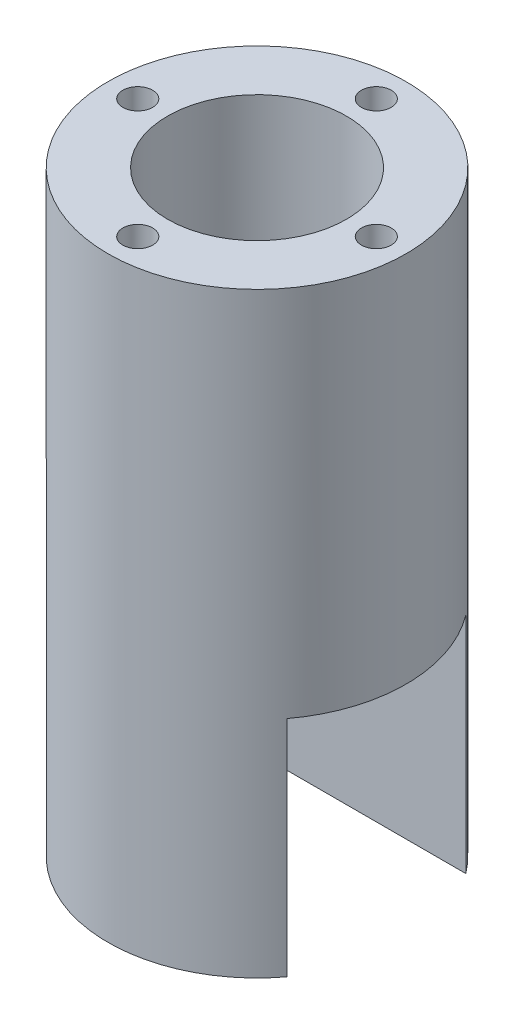
ISO-10303-21;
HEADER;
FILE_DESCRIPTION(('STEP AP214'),'2;1');
FILE_NAME('part.step','',(''),(''),'','','');
FILE_SCHEMA(('AUTOMOTIVE_DESIGN { 1 0 10303 214 1 1 1 1 }'));
ENDSEC;
DATA;
#1=APPLICATION_CONTEXT('core data for automotive mechanical design processes');
#2=APPLICATION_PROTOCOL_DEFINITION('international standard','automotive_design',2000,#1);
#3=PRODUCT_CONTEXT('',#1,'mechanical');
#4=PRODUCT('Part','Part','',(#3));
#5=PRODUCT_RELATED_PRODUCT_CATEGORY('part','',(#4));
#6=PRODUCT_DEFINITION_FORMATION('','',#4);
#7=PRODUCT_DEFINITION_CONTEXT('part definition',#1,'design');
#8=PRODUCT_DEFINITION('design','',#6,#7);
#9=PRODUCT_DEFINITION_SHAPE('','',#8);
#10=(LENGTH_UNIT() NAMED_UNIT(*) SI_UNIT(.MILLI.,.METRE.));
#11=(NAMED_UNIT(*) PLANE_ANGLE_UNIT() SI_UNIT($,.RADIAN.));
#12=(NAMED_UNIT(*) SI_UNIT($,.STERADIAN.) SOLID_ANGLE_UNIT());
#13=UNCERTAINTY_MEASURE_WITH_UNIT(LENGTH_MEASURE(1.E-05),#10,'distance_accuracy_value','');
#14=(GEOMETRIC_REPRESENTATION_CONTEXT(3) GLOBAL_UNCERTAINTY_ASSIGNED_CONTEXT((#13)) GLOBAL_UNIT_ASSIGNED_CONTEXT((#10,
#11,#12)) REPRESENTATION_CONTEXT('',''));
#15=CARTESIAN_POINT('',(0.,0.,0.));
#16=DIRECTION('',(0.,0.,1.));
#17=DIRECTION('',(1.,0.,0.));
#18=AXIS2_PLACEMENT_3D('',#15,#16,#17);
#19=CARTESIAN_POINT('',(0.,0.,0.));
#20=DIRECTION('',(0.,1.,0.));
#21=DIRECTION('',(0.,0.,1.));
#22=AXIS2_PLACEMENT_3D('',#19,#20,#21);
#23=PLANE('',#22);
#24=CARTESIAN_POINT('',(0.,0.,0.));
#25=DIRECTION('',(0.,1.,0.));
#26=DIRECTION('',(0.,0.,1.));
#27=AXIS2_PLACEMENT_3D('',#24,#25,#26);
#28=CIRCLE('',#27,10.);
#29=CARTESIAN_POINT('',(-8.,0.,6.));
#30=VERTEX_POINT('',#29);
#31=CARTESIAN_POINT('',(8.,0.,6.));
#32=VERTEX_POINT('',#31);
#33=EDGE_CURVE('E98',#30,#32,#28,.T.);
#34=ORIENTED_EDGE('',*,*,#33,.F.);
#35=DIRECTION('',(1.,0.,0.));
#36=VECTOR('',#35,1.);
#37=CARTESIAN_POINT('',(-10.,0.,6.));
#38=LINE('',#37,#36);
#39=EDGE_CURVE('E87',#30,#32,#38,.T.);
#40=ORIENTED_EDGE('',*,*,#39,.T.);
#41=EDGE_LOOP('',(#34,#40));
#42=FACE_BOUND('',#41,.T.);
#43=ADVANCED_FACE('F36',(#42),#23,.F.);
#44=CARTESIAN_POINT('',(0.,40.,0.));
#45=DIRECTION('',(0.,1.,0.));
#46=DIRECTION('',(0.,0.,1.));
#47=AXIS2_PLACEMENT_3D('',#44,#45,#46);
#48=PLANE('',#47);
#49=CARTESIAN_POINT('',(0.,40.,8.));
#50=DIRECTION('',(0.,1.,0.));
#51=DIRECTION('',(0.,0.,-1.));
#52=AXIS2_PLACEMENT_3D('',#49,#50,#51);
#53=CIRCLE('',#52,1.);
#54=CARTESIAN_POINT('',(0.,40.,7.));
#55=VERTEX_POINT('',#54);
#56=EDGE_CURVE('E124',#55,#55,#53,.T.);
#57=ORIENTED_EDGE('',*,*,#56,.F.);
#58=EDGE_LOOP('',(#57));
#59=FACE_BOUND('',#58,.T.);
#60=CARTESIAN_POINT('',(0.,40.,-8.));
#61=DIRECTION('',(0.,1.,0.));
#62=DIRECTION('',(0.,0.,1.));
#63=AXIS2_PLACEMENT_3D('',#60,#61,#62);
#64=CIRCLE('',#63,1.);
#65=CARTESIAN_POINT('',(0.,40.,-7.));
#66=VERTEX_POINT('',#65);
#67=EDGE_CURVE('E118',#66,#66,#64,.T.);
#68=ORIENTED_EDGE('',*,*,#67,.F.);
#69=EDGE_LOOP('',(#68));
#70=FACE_BOUND('',#69,.T.);
#71=CARTESIAN_POINT('',(8.,40.,0.));
#72=DIRECTION('',(0.,1.,0.));
#73=DIRECTION('',(0.,0.,-1.));
#74=AXIS2_PLACEMENT_3D('',#71,#72,#73);
#75=CIRCLE('',#74,1.);
#76=CARTESIAN_POINT('',(8.,40.,-1.));
#77=VERTEX_POINT('',#76);
#78=EDGE_CURVE('E112',#77,#77,#75,.T.);
#79=ORIENTED_EDGE('',*,*,#78,.F.);
#80=EDGE_LOOP('',(#79));
#81=FACE_BOUND('',#80,.T.);
#82=CARTESIAN_POINT('',(-8.,40.,0.));
#83=DIRECTION('',(0.,1.,0.));
#84=DIRECTION('',(0.,0.,1.));
#85=AXIS2_PLACEMENT_3D('',#82,#83,#84);
#86=CIRCLE('',#85,1.);
#87=CARTESIAN_POINT('',(-8.,40.,1.));
#88=VERTEX_POINT('',#87);
#89=EDGE_CURVE('E106',#88,#88,#86,.T.);
#90=ORIENTED_EDGE('',*,*,#89,.F.);
#91=EDGE_LOOP('',(#90));
#92=FACE_BOUND('',#91,.T.);
#93=CARTESIAN_POINT('',(0.,40.,0.));
#94=DIRECTION('',(0.,1.,0.));
#95=DIRECTION('',(0.,0.,1.));
#96=AXIS2_PLACEMENT_3D('',#93,#94,#95);
#97=CIRCLE('',#96,10.);
#98=CARTESIAN_POINT('',(0.,40.,10.));
#99=VERTEX_POINT('',#98);
#100=EDGE_CURVE('E97',#99,#99,#97,.T.);
#101=ORIENTED_EDGE('',*,*,#100,.T.);
#102=EDGE_LOOP('',(#101));
#103=FACE_BOUND('',#102,.T.);
#104=CARTESIAN_POINT('',(0.,40.,0.));
#105=DIRECTION('',(0.,1.,0.));
#106=DIRECTION('',(0.,0.,1.));
#107=AXIS2_PLACEMENT_3D('',#104,#105,#106);
#108=CIRCLE('',#107,6.);
#109=CARTESIAN_POINT('',(0.,40.,6.));
#110=VERTEX_POINT('',#109);
#111=EDGE_CURVE('E101',#110,#110,#108,.T.);
#112=ORIENTED_EDGE('',*,*,#111,.F.);
#113=EDGE_LOOP('',(#112));
#114=FACE_BOUND('',#113,.T.);
#115=ADVANCED_FACE('F161',(#59,#70,#81,#92,#103,#114),#48,.T.);
#116=CARTESIAN_POINT('',(8.,0.,-6.));
#117=VERTEX_POINT('',#116);
#118=CARTESIAN_POINT('',(-8.,0.,-6.));
#119=VERTEX_POINT('',#118);
#120=EDGE_CURVE('E83',#117,#119,#28,.T.);
#121=ORIENTED_EDGE('',*,*,#120,.F.);
#122=DIRECTION('',(1.,0.,0.));
#123=VECTOR('',#122,1.);
#124=CARTESIAN_POINT('',(-10.,0.,-6.));
#125=LINE('',#124,#123);
#126=EDGE_CURVE('E80',#119,#117,#125,.T.);
#127=ORIENTED_EDGE('',*,*,#126,.F.);
#128=EDGE_LOOP('',(#121,#127));
#129=FACE_BOUND('',#128,.T.);
#130=ADVANCED_FACE('F81',(#129),#23,.F.);
#131=CARTESIAN_POINT('',(0.,40.,0.));
#132=DIRECTION('',(0.,-1.,0.));
#133=DIRECTION('',(0.,0.,-1.));
#134=AXIS2_PLACEMENT_3D('',#131,#132,#133);
#135=CYLINDRICAL_SURFACE('',#134,10.);
#136=ORIENTED_EDGE('',*,*,#100,.F.);
#137=EDGE_LOOP('',(#136));
#138=FACE_BOUND('',#137,.T.);
#139=ORIENTED_EDGE('',*,*,#33,.T.);
#140=DIRECTION('',(0.,-1.,0.));
#141=VECTOR('',#140,1.);
#142=CARTESIAN_POINT('',(8.,40.,6.));
#143=LINE('',#142,#141);
#144=CARTESIAN_POINT('',(8.,15.,6.));
#145=VERTEX_POINT('',#144);
#146=EDGE_CURVE('E132',#32,#145,#143,.F.);
#147=ORIENTED_EDGE('',*,*,#146,.T.);
#148=CARTESIAN_POINT('',(0.,15.,0.));
#149=DIRECTION('',(0.,1.,0.));
#150=DIRECTION('',(0.,0.,1.));
#151=AXIS2_PLACEMENT_3D('',#148,#149,#150);
#152=CIRCLE('',#151,10.);
#153=CARTESIAN_POINT('',(8.00000000000001,15.,-6.));
#154=VERTEX_POINT('',#153);
#155=EDGE_CURVE('E135',#145,#154,#152,.T.);
#156=ORIENTED_EDGE('',*,*,#155,.T.);
#157=DIRECTION('',(0.,-1.,0.));
#158=VECTOR('',#157,1.);
#159=CARTESIAN_POINT('',(8.00000000000001,40.,-5.99999999999999));
#160=LINE('',#159,#158);
#161=EDGE_CURVE('E93',#154,#117,#160,.T.);
#162=ORIENTED_EDGE('',*,*,#161,.T.);
#163=ORIENTED_EDGE('',*,*,#120,.T.);
#164=DIRECTION('',(0.,-1.,0.));
#165=VECTOR('',#164,1.);
#166=CARTESIAN_POINT('',(-8.00000000000001,40.,-5.99999999999999));
#167=LINE('',#166,#165);
#168=CARTESIAN_POINT('',(-8.00000000000001,15.,-5.99999999999999));
#169=VERTEX_POINT('',#168);
#170=EDGE_CURVE('E90',#119,#169,#167,.F.);
#171=ORIENTED_EDGE('',*,*,#170,.T.);
#172=CARTESIAN_POINT('',(-8.,15.,6.));
#173=VERTEX_POINT('',#172);
#174=EDGE_CURVE('E137',#169,#173,#152,.T.);
#175=ORIENTED_EDGE('',*,*,#174,.T.);
#176=DIRECTION('',(0.,-1.,0.));
#177=VECTOR('',#176,1.);
#178=CARTESIAN_POINT('',(-8.,40.,6.));
#179=LINE('',#178,#177);
#180=EDGE_CURVE('E127',#173,#30,#179,.T.);
#181=ORIENTED_EDGE('',*,*,#180,.T.);
#182=EDGE_LOOP('',(#139,#147,#156,#162,#163,#171,#175,#181));
#183=FACE_BOUND('',#182,.T.);
#184=ADVANCED_FACE('F38',(#138,#183),#135,.T.);
#185=CARTESIAN_POINT('',(0.,40.,0.));
#186=DIRECTION('',(0.,-1.,0.));
#187=DIRECTION('',(0.,0.,-1.));
#188=AXIS2_PLACEMENT_3D('',#185,#186,#187);
#189=CYLINDRICAL_SURFACE('',#188,6.);
#190=CARTESIAN_POINT('',(0.,15.,0.));
#191=DIRECTION('',(0.,1.,0.));
#192=DIRECTION('',(0.,0.,1.));
#193=AXIS2_PLACEMENT_3D('',#190,#191,#192);
#194=CIRCLE('',#193,6.);
#195=CARTESIAN_POINT('',(0.,15.,6.));
#196=VERTEX_POINT('',#195);
#197=CARTESIAN_POINT('',(0.,15.,-5.99999999999999));
#198=VERTEX_POINT('',#197);
#199=EDGE_CURVE('E11',#196,#198,#194,.T.);
#200=ORIENTED_EDGE('',*,*,#199,.F.);
#201=EDGE_CURVE('E40',#198,#196,#194,.T.);
#202=ORIENTED_EDGE('',*,*,#201,.F.);
#203=EDGE_LOOP('',(#200,#202));
#204=FACE_BOUND('',#203,.T.);
#205=ORIENTED_EDGE('',*,*,#111,.T.);
#206=EDGE_LOOP('',(#205));
#207=FACE_BOUND('',#206,.T.);
#208=ADVANCED_FACE('F154',(#204,#207),#189,.F.);
#209=CARTESIAN_POINT('',(-8.,38.,0.));
#210=DIRECTION('',(0.,1.,0.));
#211=DIRECTION('',(0.,0.,1.));
#212=AXIS2_PLACEMENT_3D('',#209,#210,#211);
#213=CYLINDRICAL_SURFACE('',#212,1.);
#214=CARTESIAN_POINT('',(-8.,38.,0.));
#215=DIRECTION('',(0.,1.,0.));
#216=DIRECTION('',(0.,0.,1.));
#217=AXIS2_PLACEMENT_3D('',#214,#215,#216);
#218=CIRCLE('',#217,1.);
#219=CARTESIAN_POINT('',(-8.,38.,1.));
#220=VERTEX_POINT('',#219);
#221=EDGE_CURVE('E105',#220,#220,#218,.T.);
#222=ORIENTED_EDGE('',*,*,#221,.F.);
#223=EDGE_LOOP('',(#222));
#224=FACE_BOUND('',#223,.T.);
#225=ORIENTED_EDGE('',*,*,#89,.T.);
#226=EDGE_LOOP('',(#225));
#227=FACE_BOUND('',#226,.T.);
#228=ADVANCED_FACE('F175',(#224,#227),#213,.F.);
#229=CARTESIAN_POINT('',(-8.,38.,0.));
#230=DIRECTION('',(0.,1.,0.));
#231=DIRECTION('',(0.,0.,1.));
#232=AXIS2_PLACEMENT_3D('',#229,#230,#231);
#233=PLANE('',#232);
#234=ORIENTED_EDGE('',*,*,#221,.T.);
#235=EDGE_LOOP('',(#234));
#236=FACE_BOUND('',#235,.T.);
#237=ADVANCED_FACE('F184',(#236),#233,.T.);
#238=CARTESIAN_POINT('',(8.,38.,0.));
#239=DIRECTION('',(0.,1.,0.));
#240=DIRECTION('',(0.,0.,1.));
#241=AXIS2_PLACEMENT_3D('',#238,#239,#240);
#242=CYLINDRICAL_SURFACE('',#241,1.);
#243=CARTESIAN_POINT('',(8.,38.,0.));
#244=DIRECTION('',(0.,1.,0.));
#245=DIRECTION('',(0.,0.,-1.));
#246=AXIS2_PLACEMENT_3D('',#243,#244,#245);
#247=CIRCLE('',#246,1.);
#248=CARTESIAN_POINT('',(8.,38.,-1.));
#249=VERTEX_POINT('',#248);
#250=EDGE_CURVE('E109',#249,#249,#247,.T.);
#251=ORIENTED_EDGE('',*,*,#250,.F.);
#252=EDGE_LOOP('',(#251));
#253=FACE_BOUND('',#252,.T.);
#254=ORIENTED_EDGE('',*,*,#78,.T.);
#255=EDGE_LOOP('',(#254));
#256=FACE_BOUND('',#255,.T.);
#257=ADVANCED_FACE('F190',(#253,#256),#242,.F.);
#258=CARTESIAN_POINT('',(8.,38.,0.));
#259=DIRECTION('',(0.,-1.,0.));
#260=DIRECTION('',(0.,0.,-1.));
#261=AXIS2_PLACEMENT_3D('',#258,#259,#260);
#262=PLANE('',#261);
#263=ORIENTED_EDGE('',*,*,#250,.T.);
#264=EDGE_LOOP('',(#263));
#265=FACE_BOUND('',#264,.T.);
#266=ADVANCED_FACE('F194',(#265),#262,.F.);
#267=CARTESIAN_POINT('',(0.,38.,-8.));
#268=DIRECTION('',(0.,1.,0.));
#269=DIRECTION('',(0.,0.,1.));
#270=AXIS2_PLACEMENT_3D('',#267,#268,#269);
#271=CYLINDRICAL_SURFACE('',#270,1.);
#272=CARTESIAN_POINT('',(0.,38.,-8.));
#273=DIRECTION('',(0.,1.,0.));
#274=DIRECTION('',(0.,0.,1.));
#275=AXIS2_PLACEMENT_3D('',#272,#273,#274);
#276=CIRCLE('',#275,1.);
#277=CARTESIAN_POINT('',(0.,38.,-7.));
#278=VERTEX_POINT('',#277);
#279=EDGE_CURVE('E115',#278,#278,#276,.T.);
#280=ORIENTED_EDGE('',*,*,#279,.F.);
#281=EDGE_LOOP('',(#280));
#282=FACE_BOUND('',#281,.T.);
#283=ORIENTED_EDGE('',*,*,#67,.T.);
#284=EDGE_LOOP('',(#283));
#285=FACE_BOUND('',#284,.T.);
#286=ADVANCED_FACE('F198',(#282,#285),#271,.F.);
#287=CARTESIAN_POINT('',(0.,38.,-8.));
#288=DIRECTION('',(0.,1.,0.));
#289=DIRECTION('',(0.,0.,1.));
#290=AXIS2_PLACEMENT_3D('',#287,#288,#289);
#291=PLANE('',#290);
#292=ORIENTED_EDGE('',*,*,#279,.T.);
#293=EDGE_LOOP('',(#292));
#294=FACE_BOUND('',#293,.T.);
#295=ADVANCED_FACE('F202',(#294),#291,.T.);
#296=CARTESIAN_POINT('',(0.,38.,8.));
#297=DIRECTION('',(0.,1.,0.));
#298=DIRECTION('',(0.,0.,1.));
#299=AXIS2_PLACEMENT_3D('',#296,#297,#298);
#300=CYLINDRICAL_SURFACE('',#299,1.);
#301=CARTESIAN_POINT('',(0.,38.,8.));
#302=DIRECTION('',(0.,1.,0.));
#303=DIRECTION('',(0.,0.,-1.));
#304=AXIS2_PLACEMENT_3D('',#301,#302,#303);
#305=CIRCLE('',#304,1.);
#306=CARTESIAN_POINT('',(0.,38.,7.));
#307=VERTEX_POINT('',#306);
#308=EDGE_CURVE('E121',#307,#307,#305,.T.);
#309=ORIENTED_EDGE('',*,*,#308,.F.);
#310=EDGE_LOOP('',(#309));
#311=FACE_BOUND('',#310,.T.);
#312=ORIENTED_EDGE('',*,*,#56,.T.);
#313=EDGE_LOOP('',(#312));
#314=FACE_BOUND('',#313,.T.);
#315=ADVANCED_FACE('F206',(#311,#314),#300,.F.);
#316=CARTESIAN_POINT('',(0.,38.,8.));
#317=DIRECTION('',(0.,-1.,0.));
#318=DIRECTION('',(0.,0.,-1.));
#319=AXIS2_PLACEMENT_3D('',#316,#317,#318);
#320=PLANE('',#319);
#321=ORIENTED_EDGE('',*,*,#308,.T.);
#322=EDGE_LOOP('',(#321));
#323=FACE_BOUND('',#322,.T.);
#324=ADVANCED_FACE('F210',(#323),#320,.F.);
#325=CARTESIAN_POINT('',(-10.,0.,6.));
#326=DIRECTION('',(0.,0.,1.));
#327=DIRECTION('',(0.,-1.,0.));
#328=AXIS2_PLACEMENT_3D('',#325,#326,#327);
#329=PLANE('',#328);
#330=DIRECTION('',(1.,0.,0.));
#331=VECTOR('',#330,1.);
#332=CARTESIAN_POINT('',(-10.,15.,6.));
#333=LINE('',#332,#331);
#334=EDGE_CURVE('E94',#173,#196,#333,.T.);
#335=ORIENTED_EDGE('',*,*,#334,.T.);
#336=EDGE_CURVE('E142',#196,#145,#333,.T.);
#337=ORIENTED_EDGE('',*,*,#336,.T.);
#338=ORIENTED_EDGE('',*,*,#146,.F.);
#339=ORIENTED_EDGE('',*,*,#39,.F.);
#340=ORIENTED_EDGE('',*,*,#180,.F.);
#341=EDGE_LOOP('',(#335,#337,#338,#339,#340));
#342=FACE_BOUND('',#341,.T.);
#343=ADVANCED_FACE('F151',(#342),#329,.F.);
#344=CARTESIAN_POINT('',(-10.,15.,-6.));
#345=DIRECTION('',(0.,1.,0.));
#346=DIRECTION('',(0.,0.,1.));
#347=AXIS2_PLACEMENT_3D('',#344,#345,#346);
#348=PLANE('',#347);
#349=ORIENTED_EDGE('',*,*,#336,.F.);
#350=ORIENTED_EDGE('',*,*,#199,.T.);
#351=DIRECTION('',(1.,0.,0.));
#352=VECTOR('',#351,1.);
#353=CARTESIAN_POINT('',(-10.,15.,-6.));
#354=LINE('',#353,#352);
#355=EDGE_CURVE('E86',#198,#154,#354,.T.);
#356=ORIENTED_EDGE('',*,*,#355,.T.);
#357=ORIENTED_EDGE('',*,*,#155,.F.);
#358=EDGE_LOOP('',(#349,#350,#356,#357));
#359=FACE_BOUND('',#358,.T.);
#360=ADVANCED_FACE('F157',(#359),#348,.F.);
#361=EDGE_CURVE('E51',#169,#198,#354,.T.);
#362=ORIENTED_EDGE('',*,*,#361,.T.);
#363=ORIENTED_EDGE('',*,*,#201,.T.);
#364=ORIENTED_EDGE('',*,*,#334,.F.);
#365=ORIENTED_EDGE('',*,*,#174,.F.);
#366=EDGE_LOOP('',(#362,#363,#364,#365));
#367=FACE_BOUND('',#366,.T.);
#368=ADVANCED_FACE('F219',(#367),#348,.F.);
#369=CARTESIAN_POINT('',(-10.,0.,-6.));
#370=DIRECTION('',(0.,0.,-1.));
#371=DIRECTION('',(0.,1.,0.));
#372=AXIS2_PLACEMENT_3D('',#369,#370,#371);
#373=PLANE('',#372);
#374=ORIENTED_EDGE('',*,*,#355,.F.);
#375=ORIENTED_EDGE('',*,*,#361,.F.);
#376=ORIENTED_EDGE('',*,*,#170,.F.);
#377=ORIENTED_EDGE('',*,*,#126,.T.);
#378=ORIENTED_EDGE('',*,*,#161,.F.);
#379=EDGE_LOOP('',(#374,#375,#376,#377,#378));
#380=FACE_BOUND('',#379,.T.);
#381=ADVANCED_FACE('F91',(#380),#373,.F.);
#382=CLOSED_SHELL('',(#43,#115,#130,#184,#208,#228,#237,#257,#266,#286,#295,#315,#324,#343,#360,
#368,#381));
#383=MANIFOLD_SOLID_BREP('B2',#382);
#384=ADVANCED_BREP_SHAPE_REPRESENTATION('',(#18,#383),#14);
#385=SHAPE_DEFINITION_REPRESENTATION(#9,#384);
ENDSEC;
END-ISO-10303-21;
